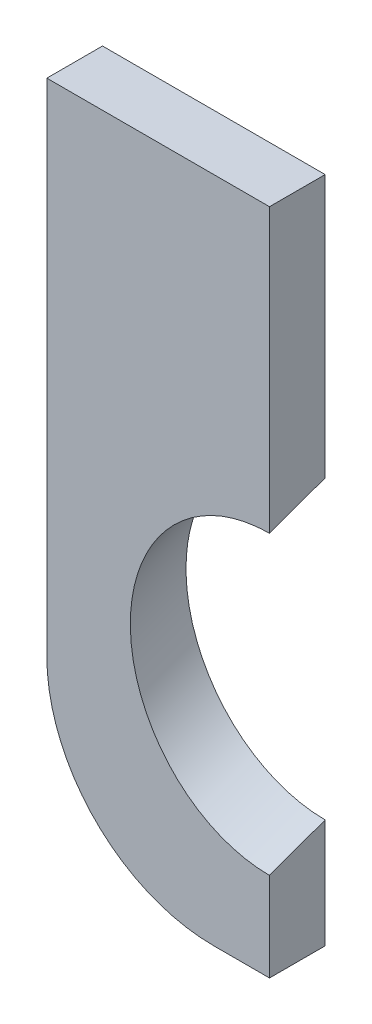
ISO-10303-21;
HEADER;
FILE_DESCRIPTION(('STEP AP214'),'2;1');
FILE_NAME('part.step','',(''),(''),'','','');
FILE_SCHEMA(('AUTOMOTIVE_DESIGN { 1 0 10303 214 1 1 1 1 }'));
ENDSEC;
DATA;
#1=APPLICATION_CONTEXT('core data for automotive mechanical design processes');
#2=APPLICATION_PROTOCOL_DEFINITION('international standard','automotive_design',2000,#1);
#3=PRODUCT_CONTEXT('',#1,'mechanical');
#4=PRODUCT('Part','Part','',(#3));
#5=PRODUCT_RELATED_PRODUCT_CATEGORY('part','',(#4));
#6=PRODUCT_DEFINITION_FORMATION('','',#4);
#7=PRODUCT_DEFINITION_CONTEXT('part definition',#1,'design');
#8=PRODUCT_DEFINITION('design','',#6,#7);
#9=PRODUCT_DEFINITION_SHAPE('','',#8);
#10=(LENGTH_UNIT() NAMED_UNIT(*) SI_UNIT(.MILLI.,.METRE.));
#11=(NAMED_UNIT(*) PLANE_ANGLE_UNIT() SI_UNIT($,.RADIAN.));
#12=(NAMED_UNIT(*) SI_UNIT($,.STERADIAN.) SOLID_ANGLE_UNIT());
#13=UNCERTAINTY_MEASURE_WITH_UNIT(LENGTH_MEASURE(1.E-05),#10,'distance_accuracy_value','');
#14=(GEOMETRIC_REPRESENTATION_CONTEXT(3) GLOBAL_UNCERTAINTY_ASSIGNED_CONTEXT((#13)) GLOBAL_UNIT_ASSIGNED_CONTEXT((#10,
#11,#12)) REPRESENTATION_CONTEXT('',''));
#15=CARTESIAN_POINT('',(0.,0.,0.));
#16=DIRECTION('',(0.,0.,1.));
#17=DIRECTION('',(1.,0.,0.));
#18=AXIS2_PLACEMENT_3D('',#15,#16,#17);
#19=CARTESIAN_POINT('',(40.,0.,-10.));
#20=DIRECTION('',(-1.,0.,0.));
#21=DIRECTION('',(0.,0.,-1.));
#22=AXIS2_PLACEMENT_3D('',#19,#20,#21);
#23=PLANE('',#22);
#24=DIRECTION('',(0.,1.,0.));
#25=VECTOR('',#24,1.);
#26=CARTESIAN_POINT('',(40.,0.,-10.));
#27=LINE('',#26,#25);
#28=CARTESIAN_POINT('',(40.,72.8112575535963,-10.));
#29=VERTEX_POINT('',#28);
#30=CARTESIAN_POINT('',(40.,120.,-10.));
#31=VERTEX_POINT('',#30);
#32=EDGE_CURVE('E133',#29,#31,#27,.T.);
#33=ORIENTED_EDGE('',*,*,#32,.T.);
#34=DIRECTION('',(0.,0.,1.));
#35=VECTOR('',#34,1.);
#36=CARTESIAN_POINT('',(40.,120.,-10.));
#37=LINE('',#36,#35);
#38=CARTESIAN_POINT('',(40.,120.,0.));
#39=VERTEX_POINT('',#38);
#40=EDGE_CURVE('E43',#31,#39,#37,.T.);
#41=ORIENTED_EDGE('',*,*,#40,.T.);
#42=DIRECTION('',(0.,1.,0.));
#43=VECTOR('',#42,1.);
#44=CARTESIAN_POINT('',(40.,0.,0.));
#45=LINE('',#44,#43);
#46=CARTESIAN_POINT('',(40.,69.1715552109343,0.));
#47=VERTEX_POINT('',#46);
#48=EDGE_CURVE('E126',#47,#39,#45,.T.);
#49=ORIENTED_EDGE('',*,*,#48,.F.);
#50=DIRECTION('',(0.,-0.342020143325669,0.939692620785908));
#51=VECTOR('',#50,1.);
#52=CARTESIAN_POINT('',(40.,78.3312918123781,-25.1661694806188));
#53=LINE('',#52,#51);
#54=EDGE_CURVE('E152',#29,#47,#53,.T.);
#55=ORIENTED_EDGE('',*,*,#54,.F.);
#56=EDGE_LOOP('',(#33,#41,#49,#55));
#57=FACE_BOUND('',#56,.T.);
#58=ADVANCED_FACE('F35',(#57),#23,.F.);
#59=CARTESIAN_POINT('',(40.,0.,0.));
#60=VERTEX_POINT('',#59);
#61=CARTESIAN_POINT('',(40.,15.9626665871387,0.));
#62=VERTEX_POINT('',#61);
#63=EDGE_CURVE('E123',#60,#62,#45,.T.);
#64=ORIENTED_EDGE('',*,*,#63,.F.);
#65=DIRECTION('',(0.,0.,1.));
#66=VECTOR('',#65,1.);
#67=CARTESIAN_POINT('',(40.,0.,-10.));
#68=LINE('',#67,#66);
#69=CARTESIAN_POINT('',(40.,0.,-10.));
#70=VERTEX_POINT('',#69);
#71=EDGE_CURVE('E122',#70,#60,#68,.T.);
#72=ORIENTED_EDGE('',*,*,#71,.F.);
#73=CARTESIAN_POINT('',(40.,19.6023689298007,-10.));
#74=VERTEX_POINT('',#73);
#75=EDGE_CURVE('E117',#70,#74,#27,.T.);
#76=ORIENTED_EDGE('',*,*,#75,.T.);
#77=DIRECTION('',(0.,-0.342020143325669,0.939692620785908));
#78=VECTOR('',#77,1.);
#79=CARTESIAN_POINT('',(40.,31.3466607730827,-42.2671766469023));
#80=LINE('',#79,#78);
#81=EDGE_CURVE('E148',#74,#62,#80,.T.);
#82=ORIENTED_EDGE('',*,*,#81,.T.);
#83=EDGE_LOOP('',(#64,#72,#76,#82));
#84=FACE_BOUND('',#83,.T.);
#85=ADVANCED_FACE('F37',(#84),#23,.F.);
#86=CARTESIAN_POINT('',(0.,120.,-10.));
#87=DIRECTION('',(0.,-1.,0.));
#88=DIRECTION('',(0.,0.,1.));
#89=AXIS2_PLACEMENT_3D('',#86,#87,#88);
#90=PLANE('',#89);
#91=DIRECTION('',(-1.,0.,0.));
#92=VECTOR('',#91,1.);
#93=CARTESIAN_POINT('',(0.,120.,0.));
#94=LINE('',#93,#92);
#95=CARTESIAN_POINT('',(0.,120.,0.));
#96=VERTEX_POINT('',#95);
#97=EDGE_CURVE('E125',#39,#96,#94,.T.);
#98=ORIENTED_EDGE('',*,*,#97,.F.);
#99=ORIENTED_EDGE('',*,*,#40,.F.);
#100=DIRECTION('',(-1.,0.,0.));
#101=VECTOR('',#100,1.);
#102=CARTESIAN_POINT('',(0.,120.,-10.));
#103=LINE('',#102,#101);
#104=CARTESIAN_POINT('',(0.,120.,-10.));
#105=VERTEX_POINT('',#104);
#106=EDGE_CURVE('E89',#31,#105,#103,.T.);
#107=ORIENTED_EDGE('',*,*,#106,.T.);
#108=DIRECTION('',(0.,0.,1.));
#109=VECTOR('',#108,1.);
#110=CARTESIAN_POINT('',(0.,120.,-10.));
#111=LINE('',#110,#109);
#112=EDGE_CURVE('E111',#105,#96,#111,.T.);
#113=ORIENTED_EDGE('',*,*,#112,.T.);
#114=EDGE_LOOP('',(#98,#99,#107,#113));
#115=FACE_BOUND('',#114,.T.);
#116=ADVANCED_FACE('F144',(#115),#90,.F.);
#117=CARTESIAN_POINT('',(0.,30.0000000000002,-10.));
#118=DIRECTION('',(1.,0.,0.));
#119=DIRECTION('',(0.,0.,1.));
#120=AXIS2_PLACEMENT_3D('',#117,#118,#119);
#121=PLANE('',#120);
#122=DIRECTION('',(0.,-1.,0.));
#123=VECTOR('',#122,1.);
#124=CARTESIAN_POINT('',(0.,30.0000000000002,0.));
#125=LINE('',#124,#123);
#126=CARTESIAN_POINT('',(0.,30.0000000000002,0.));
#127=VERTEX_POINT('',#126);
#128=EDGE_CURVE('E129',#96,#127,#125,.T.);
#129=ORIENTED_EDGE('',*,*,#128,.F.);
#130=ORIENTED_EDGE('',*,*,#112,.F.);
#131=DIRECTION('',(0.,-1.,0.));
#132=VECTOR('',#131,1.);
#133=CARTESIAN_POINT('',(0.,30.0000000000002,-10.));
#134=LINE('',#133,#132);
#135=CARTESIAN_POINT('',(0.,30.0000000000002,-10.));
#136=VERTEX_POINT('',#135);
#137=EDGE_CURVE('E100',#105,#136,#134,.T.);
#138=ORIENTED_EDGE('',*,*,#137,.T.);
#139=DIRECTION('',(0.,0.,1.));
#140=VECTOR('',#139,1.);
#141=CARTESIAN_POINT('',(0.,30.0000000000002,-10.));
#142=LINE('',#141,#140);
#143=EDGE_CURVE('E106',#136,#127,#142,.T.);
#144=ORIENTED_EDGE('',*,*,#143,.T.);
#145=EDGE_LOOP('',(#129,#130,#138,#144));
#146=FACE_BOUND('',#145,.T.);
#147=ADVANCED_FACE('F114',(#146),#121,.F.);
#148=CARTESIAN_POINT('',(30.,30.,-10.));
#149=DIRECTION('',(0.,0.,1.));
#150=DIRECTION('',(-1.,0.,0.));
#151=AXIS2_PLACEMENT_3D('',#148,#149,#150);
#152=CYLINDRICAL_SURFACE('',#151,30.);
#153=CARTESIAN_POINT('',(30.,30.,0.));
#154=DIRECTION('',(0.,0.,1.));
#155=DIRECTION('',(-1.,0.,0.));
#156=AXIS2_PLACEMENT_3D('',#153,#154,#155);
#157=CIRCLE('',#156,30.);
#158=CARTESIAN_POINT('',(30.0000000000002,0.,0.));
#159=VERTEX_POINT('',#158);
#160=EDGE_CURVE('E108',#127,#159,#157,.T.);
#161=ORIENTED_EDGE('',*,*,#160,.F.);
#162=ORIENTED_EDGE('',*,*,#143,.F.);
#163=CARTESIAN_POINT('',(30.,30.,-10.));
#164=DIRECTION('',(0.,0.,1.));
#165=DIRECTION('',(-1.,0.,0.));
#166=AXIS2_PLACEMENT_3D('',#163,#164,#165);
#167=CIRCLE('',#166,30.);
#168=CARTESIAN_POINT('',(30.0000000000002,0.,-10.));
#169=VERTEX_POINT('',#168);
#170=EDGE_CURVE('E96',#136,#169,#167,.T.);
#171=ORIENTED_EDGE('',*,*,#170,.T.);
#172=DIRECTION('',(0.,0.,1.));
#173=VECTOR('',#172,1.);
#174=CARTESIAN_POINT('',(30.0000000000002,0.,-10.));
#175=LINE('',#174,#173);
#176=EDGE_CURVE('E112',#169,#159,#175,.T.);
#177=ORIENTED_EDGE('',*,*,#176,.T.);
#178=EDGE_LOOP('',(#161,#162,#171,#177));
#179=FACE_BOUND('',#178,.T.);
#180=ADVANCED_FACE('F107',(#179),#152,.T.);
#181=CARTESIAN_POINT('',(30.0000000000002,0.,-10.));
#182=DIRECTION('',(0.,1.,0.));
#183=DIRECTION('',(0.,0.,-1.));
#184=AXIS2_PLACEMENT_3D('',#181,#182,#183);
#185=PLANE('',#184);
#186=DIRECTION('',(1.,0.,0.));
#187=VECTOR('',#186,1.);
#188=CARTESIAN_POINT('',(30.0000000000002,0.,0.));
#189=LINE('',#188,#187);
#190=EDGE_CURVE('E81',#159,#60,#189,.T.);
#191=ORIENTED_EDGE('',*,*,#190,.F.);
#192=ORIENTED_EDGE('',*,*,#176,.F.);
#193=DIRECTION('',(1.,0.,0.));
#194=VECTOR('',#193,1.);
#195=CARTESIAN_POINT('',(30.0000000000002,0.,-10.));
#196=LINE('',#195,#194);
#197=EDGE_CURVE('E57',#169,#70,#196,.T.);
#198=ORIENTED_EDGE('',*,*,#197,.T.);
#199=ORIENTED_EDGE('',*,*,#71,.T.);
#200=EDGE_LOOP('',(#191,#192,#198,#199));
#201=FACE_BOUND('',#200,.T.);
#202=ADVANCED_FACE('F181',(#201),#185,.F.);
#203=CARTESIAN_POINT('',(30.,30.,-10.));
#204=DIRECTION('',(0.,0.,1.));
#205=DIRECTION('',(-1.,0.,0.));
#206=AXIS2_PLACEMENT_3D('',#203,#204,#205);
#207=PLANE('',#206);
#208=ORIENTED_EDGE('',*,*,#75,.F.);
#209=ORIENTED_EDGE('',*,*,#197,.F.);
#210=ORIENTED_EDGE('',*,*,#170,.F.);
#211=ORIENTED_EDGE('',*,*,#137,.F.);
#212=ORIENTED_EDGE('',*,*,#106,.F.);
#213=ORIENTED_EDGE('',*,*,#32,.F.);
#214=CARTESIAN_POINT('',(40.,46.2068132416985,-10.));
#215=DIRECTION('',(0.,0.,-1.));
#216=DIRECTION('',(0.,-1.,0.));
#217=AXIS2_PLACEMENT_3D('',#214,#215,#216);
#218=ELLIPSE('',#217,26.6044443118978,25.);
#219=EDGE_CURVE('E146',#74,#29,#218,.T.);
#220=ORIENTED_EDGE('',*,*,#219,.F.);
#221=EDGE_LOOP('',(#208,#209,#210,#211,#212,#213,#220));
#222=FACE_BOUND('',#221,.T.);
#223=ADVANCED_FACE('F98',(#222),#207,.F.);
#224=CARTESIAN_POINT('',(30.,30.,0.));
#225=DIRECTION('',(0.,0.,1.));
#226=DIRECTION('',(-1.,0.,0.));
#227=AXIS2_PLACEMENT_3D('',#224,#225,#226);
#228=PLANE('',#227);
#229=CARTESIAN_POINT('',(40.,42.5671108990365,0.));
#230=DIRECTION('',(0.,0.,-1.));
#231=DIRECTION('',(0.,-1.,0.));
#232=AXIS2_PLACEMENT_3D('',#229,#230,#231);
#233=ELLIPSE('',#232,26.6044443118978,25.);
#234=EDGE_CURVE('E11',#62,#47,#233,.T.);
#235=ORIENTED_EDGE('',*,*,#234,.T.);
#236=ORIENTED_EDGE('',*,*,#48,.T.);
#237=ORIENTED_EDGE('',*,*,#97,.T.);
#238=ORIENTED_EDGE('',*,*,#128,.T.);
#239=ORIENTED_EDGE('',*,*,#160,.T.);
#240=ORIENTED_EDGE('',*,*,#190,.T.);
#241=ORIENTED_EDGE('',*,*,#63,.T.);
#242=EDGE_LOOP('',(#235,#236,#237,#238,#239,#240,#241));
#243=FACE_BOUND('',#242,.T.);
#244=ADVANCED_FACE('F145',(#243),#228,.T.);
#245=CARTESIAN_POINT('',(40.,54.8389762927304,-33.7166730637605));
#246=DIRECTION('',(0.,-0.342020143325669,0.939692620785908));
#247=DIRECTION('',(0.,0.939692620785908,0.342020143325669));
#248=AXIS2_PLACEMENT_3D('',#245,#246,#247);
#249=CYLINDRICAL_SURFACE('',#248,25.);
#250=ORIENTED_EDGE('',*,*,#81,.F.);
#251=ORIENTED_EDGE('',*,*,#219,.T.);
#252=ORIENTED_EDGE('',*,*,#54,.T.);
#253=ORIENTED_EDGE('',*,*,#234,.F.);
#254=EDGE_LOOP('',(#250,#251,#252,#253));
#255=FACE_BOUND('',#254,.T.);
#256=ADVANCED_FACE('F159',(#255),#249,.F.);
#257=CLOSED_SHELL('',(#58,#85,#116,#147,#180,#202,#223,#244,#256));
#258=MANIFOLD_SOLID_BREP('B2',#257);
#259=ADVANCED_BREP_SHAPE_REPRESENTATION('',(#18,#258),#14);
#260=SHAPE_DEFINITION_REPRESENTATION(#9,#259);
ENDSEC;
END-ISO-10303-21;
